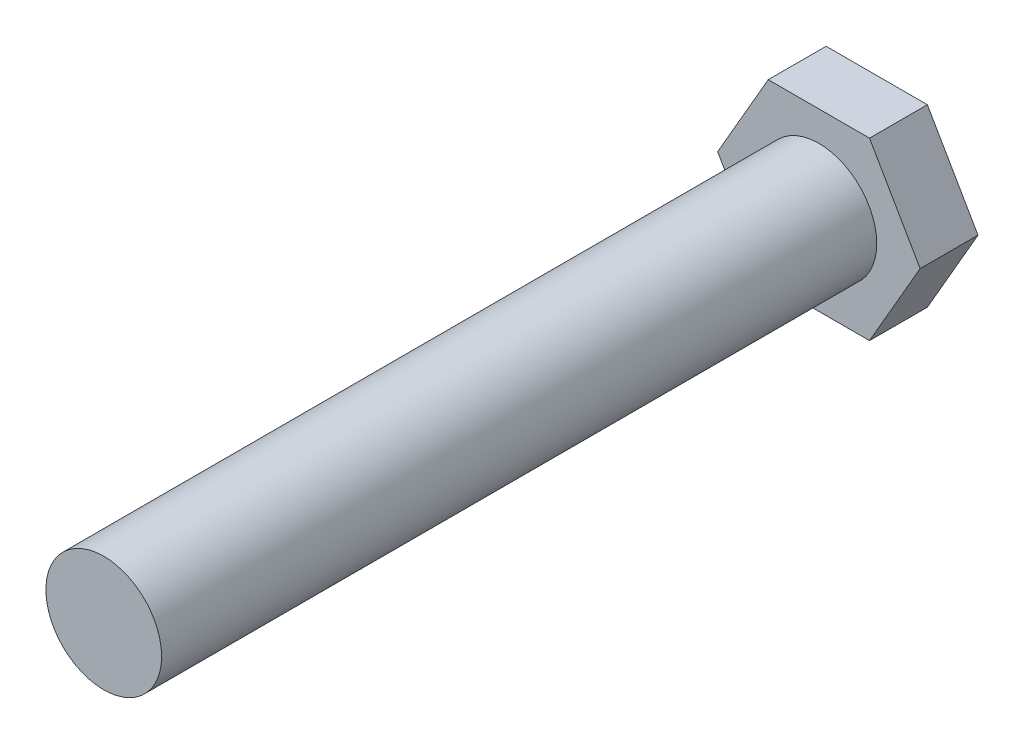
ISO-10303-21;
HEADER;
FILE_DESCRIPTION(('STEP AP214'),'2;1');
FILE_NAME('part.step','',(''),(''),'','','');
FILE_SCHEMA(('AUTOMOTIVE_DESIGN { 1 0 10303 214 1 1 1 1 }'));
ENDSEC;
DATA;
#1=APPLICATION_CONTEXT('core data for automotive mechanical design processes');
#2=APPLICATION_PROTOCOL_DEFINITION('international standard','automotive_design',2000,#1);
#3=PRODUCT_CONTEXT('',#1,'mechanical');
#4=PRODUCT('Part','Part','',(#3));
#5=PRODUCT_RELATED_PRODUCT_CATEGORY('part','',(#4));
#6=PRODUCT_DEFINITION_FORMATION('','',#4);
#7=PRODUCT_DEFINITION_CONTEXT('part definition',#1,'design');
#8=PRODUCT_DEFINITION('design','',#6,#7);
#9=PRODUCT_DEFINITION_SHAPE('','',#8);
#10=(LENGTH_UNIT() NAMED_UNIT(*) SI_UNIT(.MILLI.,.METRE.));
#11=(NAMED_UNIT(*) PLANE_ANGLE_UNIT() SI_UNIT($,.RADIAN.));
#12=(NAMED_UNIT(*) SI_UNIT($,.STERADIAN.) SOLID_ANGLE_UNIT());
#13=UNCERTAINTY_MEASURE_WITH_UNIT(LENGTH_MEASURE(1.E-05),#10,'distance_accuracy_value','');
#14=(GEOMETRIC_REPRESENTATION_CONTEXT(3) GLOBAL_UNCERTAINTY_ASSIGNED_CONTEXT((#13)) GLOBAL_UNIT_ASSIGNED_CONTEXT((#10,
#11,#12)) REPRESENTATION_CONTEXT('',''));
#15=CARTESIAN_POINT('',(0.,0.,0.));
#16=DIRECTION('',(0.,0.,1.));
#17=DIRECTION('',(1.,0.,0.));
#18=AXIS2_PLACEMENT_3D('',#15,#16,#17);
#19=CARTESIAN_POINT('',(22.225,0.,12.7));
#20=DIRECTION('',(0.,0.,1.));
#21=DIRECTION('',(1.,0.,0.));
#22=AXIS2_PLACEMENT_3D('',#19,#20,#21);
#23=PLANE('',#22);
#24=DIRECTION('',(0.5,0.866025403784439,0.));
#25=VECTOR('',#24,1.);
#26=CARTESIAN_POINT('',(11.1125,-19.2474145991092,12.7));
#27=LINE('',#26,#25);
#28=CARTESIAN_POINT('',(11.1125,-19.2474145991092,12.7));
#29=VERTEX_POINT('',#28);
#30=CARTESIAN_POINT('',(22.225,0.,12.7));
#31=VERTEX_POINT('',#30);
#32=EDGE_CURVE('E113',#29,#31,#27,.T.);
#33=ORIENTED_EDGE('',*,*,#32,.T.);
#34=DIRECTION('',(-0.5,0.866025403784439,0.));
#35=VECTOR('',#34,1.);
#36=CARTESIAN_POINT('',(22.225,0.,12.7));
#37=LINE('',#36,#35);
#38=CARTESIAN_POINT('',(11.1125,19.2474145991092,12.7));
#39=VERTEX_POINT('',#38);
#40=EDGE_CURVE('E71',#31,#39,#37,.T.);
#41=ORIENTED_EDGE('',*,*,#40,.T.);
#42=DIRECTION('',(-1.,0.,0.));
#43=VECTOR('',#42,1.);
#44=CARTESIAN_POINT('',(11.1125,19.2474145991092,12.7));
#45=LINE('',#44,#43);
#46=CARTESIAN_POINT('',(-11.1125,19.2474145991092,12.7));
#47=VERTEX_POINT('',#46);
#48=EDGE_CURVE('E84',#39,#47,#45,.T.);
#49=ORIENTED_EDGE('',*,*,#48,.T.);
#50=DIRECTION('',(-0.5,-0.866025403784439,0.));
#51=VECTOR('',#50,1.);
#52=CARTESIAN_POINT('',(-11.1125,19.2474145991092,12.7));
#53=LINE('',#52,#51);
#54=CARTESIAN_POINT('',(-22.225,0.,12.7));
#55=VERTEX_POINT('',#54);
#56=EDGE_CURVE('E78',#47,#55,#53,.T.);
#57=ORIENTED_EDGE('',*,*,#56,.T.);
#58=DIRECTION('',(0.5,-0.866025403784439,0.));
#59=VECTOR('',#58,1.);
#60=CARTESIAN_POINT('',(-22.225,0.,12.7));
#61=LINE('',#60,#59);
#62=CARTESIAN_POINT('',(-11.1125,-19.2474145991092,12.7));
#63=VERTEX_POINT('',#62);
#64=EDGE_CURVE('E82',#55,#63,#61,.T.);
#65=ORIENTED_EDGE('',*,*,#64,.T.);
#66=DIRECTION('',(1.,0.,0.));
#67=VECTOR('',#66,1.);
#68=CARTESIAN_POINT('',(-11.1125,-19.2474145991092,12.7));
#69=LINE('',#68,#67);
#70=EDGE_CURVE('E34',#63,#29,#69,.T.);
#71=ORIENTED_EDGE('',*,*,#70,.T.);
#72=EDGE_LOOP('',(#33,#41,#49,#57,#65,#71));
#73=FACE_BOUND('',#72,.T.);
#74=CARTESIAN_POINT('',(0.,0.,12.7));
#75=DIRECTION('',(0.,0.,1.));
#76=DIRECTION('',(1.,0.,0.));
#77=AXIS2_PLACEMENT_3D('',#74,#75,#76);
#78=CIRCLE('',#77,12.7);
#79=CARTESIAN_POINT('',(12.7,0.,12.7));
#80=VERTEX_POINT('',#79);
#81=EDGE_CURVE('E157',#80,#80,#78,.T.);
#82=ORIENTED_EDGE('',*,*,#81,.F.);
#83=EDGE_LOOP('',(#82));
#84=FACE_BOUND('',#83,.T.);
#85=ADVANCED_FACE('F17',(#73,#84),#23,.T.);
#86=CARTESIAN_POINT('',(11.1125,-19.2474145991092,12.7));
#87=DIRECTION('',(-0.866025403784439,0.5,0.));
#88=DIRECTION('',(-0.5,-0.866025403784439,0.));
#89=AXIS2_PLACEMENT_3D('',#86,#87,#88);
#90=PLANE('',#89);
#91=DIRECTION('',(0.5,0.866025403784439,0.));
#92=VECTOR('',#91,1.);
#93=CARTESIAN_POINT('',(11.1125,-19.2474145991092,0.));
#94=LINE('',#93,#92);
#95=CARTESIAN_POINT('',(11.1125,-19.2474145991092,0.));
#96=VERTEX_POINT('',#95);
#97=CARTESIAN_POINT('',(22.225,0.,0.));
#98=VERTEX_POINT('',#97);
#99=EDGE_CURVE('E102',#96,#98,#94,.T.);
#100=ORIENTED_EDGE('',*,*,#99,.T.);
#101=DIRECTION('',(0.,0.,-1.));
#102=VECTOR('',#101,1.);
#103=CARTESIAN_POINT('',(22.225,0.,12.7));
#104=LINE('',#103,#102);
#105=EDGE_CURVE('E11',#31,#98,#104,.T.);
#106=ORIENTED_EDGE('',*,*,#105,.F.);
#107=ORIENTED_EDGE('',*,*,#32,.F.);
#108=DIRECTION('',(0.,0.,-1.));
#109=VECTOR('',#108,1.);
#110=CARTESIAN_POINT('',(11.1125,-19.2474145991092,12.7));
#111=LINE('',#110,#109);
#112=EDGE_CURVE('E98',#29,#96,#111,.T.);
#113=ORIENTED_EDGE('',*,*,#112,.T.);
#114=EDGE_LOOP('',(#100,#106,#107,#113));
#115=FACE_BOUND('',#114,.T.);
#116=ADVANCED_FACE('F19',(#115),#90,.F.);
#117=CARTESIAN_POINT('',(22.225,0.,12.7));
#118=DIRECTION('',(-0.866025403784439,-0.5,0.));
#119=DIRECTION('',(0.5,-0.866025403784439,0.));
#120=AXIS2_PLACEMENT_3D('',#117,#118,#119);
#121=PLANE('',#120);
#122=DIRECTION('',(-0.5,0.866025403784439,0.));
#123=VECTOR('',#122,1.);
#124=CARTESIAN_POINT('',(22.225,0.,0.));
#125=LINE('',#124,#123);
#126=CARTESIAN_POINT('',(11.1125,19.2474145991092,0.));
#127=VERTEX_POINT('',#126);
#128=EDGE_CURVE('E105',#98,#127,#125,.T.);
#129=ORIENTED_EDGE('',*,*,#128,.T.);
#130=DIRECTION('',(0.,0.,-1.));
#131=VECTOR('',#130,1.);
#132=CARTESIAN_POINT('',(11.1125,19.2474145991092,12.7));
#133=LINE('',#132,#131);
#134=EDGE_CURVE('E26',#39,#127,#133,.T.);
#135=ORIENTED_EDGE('',*,*,#134,.F.);
#136=ORIENTED_EDGE('',*,*,#40,.F.);
#137=ORIENTED_EDGE('',*,*,#105,.T.);
#138=EDGE_LOOP('',(#129,#135,#136,#137));
#139=FACE_BOUND('',#138,.T.);
#140=ADVANCED_FACE('F144',(#139),#121,.F.);
#141=CARTESIAN_POINT('',(11.1125,19.2474145991092,12.7));
#142=DIRECTION('',(0.,-1.,0.));
#143=DIRECTION('',(0.,0.,-1.));
#144=AXIS2_PLACEMENT_3D('',#141,#142,#143);
#145=PLANE('',#144);
#146=DIRECTION('',(-1.,0.,0.));
#147=VECTOR('',#146,1.);
#148=CARTESIAN_POINT('',(11.1125,19.2474145991092,0.));
#149=LINE('',#148,#147);
#150=CARTESIAN_POINT('',(-11.1125,19.2474145991092,0.));
#151=VERTEX_POINT('',#150);
#152=EDGE_CURVE('E108',#127,#151,#149,.T.);
#153=ORIENTED_EDGE('',*,*,#152,.T.);
#154=DIRECTION('',(0.,0.,-1.));
#155=VECTOR('',#154,1.);
#156=CARTESIAN_POINT('',(-11.1125,19.2474145991092,12.7));
#157=LINE('',#156,#155);
#158=EDGE_CURVE('E93',#47,#151,#157,.T.);
#159=ORIENTED_EDGE('',*,*,#158,.F.);
#160=ORIENTED_EDGE('',*,*,#48,.F.);
#161=ORIENTED_EDGE('',*,*,#134,.T.);
#162=EDGE_LOOP('',(#153,#159,#160,#161));
#163=FACE_BOUND('',#162,.T.);
#164=ADVANCED_FACE('F119',(#163),#145,.F.);
#165=CARTESIAN_POINT('',(-11.1125,19.2474145991092,12.7));
#166=DIRECTION('',(0.866025403784439,-0.5,0.));
#167=DIRECTION('',(0.5,0.866025403784439,0.));
#168=AXIS2_PLACEMENT_3D('',#165,#166,#167);
#169=PLANE('',#168);
#170=DIRECTION('',(-0.5,-0.866025403784439,0.));
#171=VECTOR('',#170,1.);
#172=CARTESIAN_POINT('',(-11.1125,19.2474145991092,0.));
#173=LINE('',#172,#171);
#174=CARTESIAN_POINT('',(-22.225,0.,0.));
#175=VERTEX_POINT('',#174);
#176=EDGE_CURVE('E92',#151,#175,#173,.T.);
#177=ORIENTED_EDGE('',*,*,#176,.T.);
#178=DIRECTION('',(0.,0.,-1.));
#179=VECTOR('',#178,1.);
#180=CARTESIAN_POINT('',(-22.225,0.,12.7));
#181=LINE('',#180,#179);
#182=EDGE_CURVE('E89',#55,#175,#181,.T.);
#183=ORIENTED_EDGE('',*,*,#182,.F.);
#184=ORIENTED_EDGE('',*,*,#56,.F.);
#185=ORIENTED_EDGE('',*,*,#158,.T.);
#186=EDGE_LOOP('',(#177,#183,#184,#185));
#187=FACE_BOUND('',#186,.T.);
#188=ADVANCED_FACE('F90',(#187),#169,.F.);
#189=CARTESIAN_POINT('',(-22.225,0.,12.7));
#190=DIRECTION('',(0.866025403784439,0.5,0.));
#191=DIRECTION('',(-0.5,0.866025403784439,0.));
#192=AXIS2_PLACEMENT_3D('',#189,#190,#191);
#193=PLANE('',#192);
#194=DIRECTION('',(0.5,-0.866025403784439,0.));
#195=VECTOR('',#194,1.);
#196=CARTESIAN_POINT('',(-22.225,0.,0.));
#197=LINE('',#196,#195);
#198=CARTESIAN_POINT('',(-11.1125,-19.2474145991092,0.));
#199=VERTEX_POINT('',#198);
#200=EDGE_CURVE('E57',#175,#199,#197,.T.);
#201=ORIENTED_EDGE('',*,*,#200,.T.);
#202=DIRECTION('',(0.,0.,-1.));
#203=VECTOR('',#202,1.);
#204=CARTESIAN_POINT('',(-11.1125,-19.2474145991092,12.7));
#205=LINE('',#204,#203);
#206=EDGE_CURVE('E94',#63,#199,#205,.T.);
#207=ORIENTED_EDGE('',*,*,#206,.F.);
#208=ORIENTED_EDGE('',*,*,#64,.F.);
#209=ORIENTED_EDGE('',*,*,#182,.T.);
#210=EDGE_LOOP('',(#201,#207,#208,#209));
#211=FACE_BOUND('',#210,.T.);
#212=ADVANCED_FACE('F96',(#211),#193,.F.);
#213=CARTESIAN_POINT('',(-11.1125,-19.2474145991092,12.7));
#214=DIRECTION('',(0.,1.,0.));
#215=DIRECTION('',(0.,0.,1.));
#216=AXIS2_PLACEMENT_3D('',#213,#214,#215);
#217=PLANE('',#216);
#218=DIRECTION('',(1.,0.,0.));
#219=VECTOR('',#218,1.);
#220=CARTESIAN_POINT('',(-11.1125,-19.2474145991092,0.));
#221=LINE('',#220,#219);
#222=EDGE_CURVE('E63',#199,#96,#221,.T.);
#223=ORIENTED_EDGE('',*,*,#222,.T.);
#224=ORIENTED_EDGE('',*,*,#112,.F.);
#225=ORIENTED_EDGE('',*,*,#70,.F.);
#226=ORIENTED_EDGE('',*,*,#206,.T.);
#227=EDGE_LOOP('',(#223,#224,#225,#226));
#228=FACE_BOUND('',#227,.T.);
#229=ADVANCED_FACE('F126',(#228),#217,.F.);
#230=CARTESIAN_POINT('',(22.225,0.,0.));
#231=DIRECTION('',(0.,0.,1.));
#232=DIRECTION('',(1.,0.,0.));
#233=AXIS2_PLACEMENT_3D('',#230,#231,#232);
#234=PLANE('',#233);
#235=ORIENTED_EDGE('',*,*,#99,.F.);
#236=ORIENTED_EDGE('',*,*,#222,.F.);
#237=ORIENTED_EDGE('',*,*,#200,.F.);
#238=ORIENTED_EDGE('',*,*,#176,.F.);
#239=ORIENTED_EDGE('',*,*,#152,.F.);
#240=ORIENTED_EDGE('',*,*,#128,.F.);
#241=EDGE_LOOP('',(#235,#236,#237,#238,#239,#240));
#242=FACE_BOUND('',#241,.T.);
#243=ADVANCED_FACE('F122',(#242),#234,.F.);
#244=CARTESIAN_POINT('',(0.,0.,169.672));
#245=DIRECTION('',(0.,0.,-1.));
#246=DIRECTION('',(-1.,0.,0.));
#247=AXIS2_PLACEMENT_3D('',#244,#245,#246);
#248=CYLINDRICAL_SURFACE('',#247,12.7);
#249=CARTESIAN_POINT('',(0.,0.,169.672));
#250=DIRECTION('',(0.,0.,1.));
#251=DIRECTION('',(1.,0.,0.));
#252=AXIS2_PLACEMENT_3D('',#249,#250,#251);
#253=CIRCLE('',#252,12.7);
#254=CARTESIAN_POINT('',(12.7,0.,169.672));
#255=VERTEX_POINT('',#254);
#256=EDGE_CURVE('E106',#255,#255,#253,.T.);
#257=ORIENTED_EDGE('',*,*,#256,.F.);
#258=EDGE_LOOP('',(#257));
#259=FACE_BOUND('',#258,.T.);
#260=ORIENTED_EDGE('',*,*,#81,.T.);
#261=EDGE_LOOP('',(#260));
#262=FACE_BOUND('',#261,.T.);
#263=ADVANCED_FACE('F135',(#259,#262),#248,.T.);
#264=CARTESIAN_POINT('',(0.,0.,169.672));
#265=DIRECTION('',(0.,0.,1.));
#266=DIRECTION('',(1.,0.,0.));
#267=AXIS2_PLACEMENT_3D('',#264,#265,#266);
#268=PLANE('',#267);
#269=ORIENTED_EDGE('',*,*,#256,.T.);
#270=EDGE_LOOP('',(#269));
#271=FACE_BOUND('',#270,.T.);
#272=ADVANCED_FACE('F148',(#271),#268,.T.);
#273=CLOSED_SHELL('',(#85,#116,#140,#164,#188,#212,#229,#243,#263,#272));
#274=MANIFOLD_SOLID_BREP('B1',#273);
#275=ADVANCED_BREP_SHAPE_REPRESENTATION('',(#18,#274),#14);
#276=SHAPE_DEFINITION_REPRESENTATION(#9,#275);
ENDSEC;
END-ISO-10303-21;
